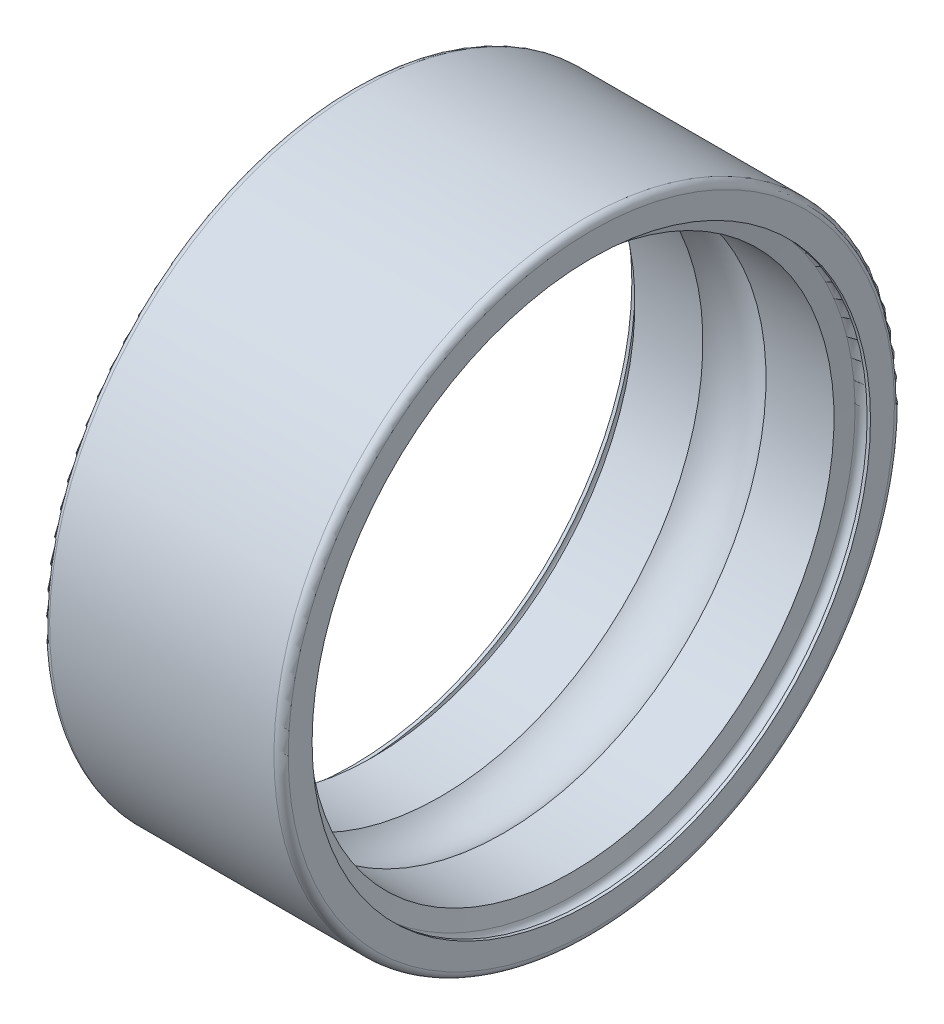
ISO-10303-21;
HEADER;
FILE_DESCRIPTION(('STEP AP214'),'2;1');
FILE_NAME('part.step','',(''),(''),'','','');
FILE_SCHEMA(('AUTOMOTIVE_DESIGN { 1 0 10303 214 1 1 1 1 }'));
ENDSEC;
DATA;
#1=APPLICATION_CONTEXT('core data for automotive mechanical design processes');
#2=APPLICATION_PROTOCOL_DEFINITION('international standard','automotive_design',2000,#1);
#3=PRODUCT_CONTEXT('',#1,'mechanical');
#4=PRODUCT('Part','Part','',(#3));
#5=PRODUCT_RELATED_PRODUCT_CATEGORY('part','',(#4));
#6=PRODUCT_DEFINITION_FORMATION('','',#4);
#7=PRODUCT_DEFINITION_CONTEXT('part definition',#1,'design');
#8=PRODUCT_DEFINITION('design','',#6,#7);
#9=PRODUCT_DEFINITION_SHAPE('','',#8);
#10=(LENGTH_UNIT() NAMED_UNIT(*) SI_UNIT(.MILLI.,.METRE.));
#11=(NAMED_UNIT(*) PLANE_ANGLE_UNIT() SI_UNIT($,.RADIAN.));
#12=(NAMED_UNIT(*) SI_UNIT($,.STERADIAN.) SOLID_ANGLE_UNIT());
#13=UNCERTAINTY_MEASURE_WITH_UNIT(LENGTH_MEASURE(1.E-05),#10,'distance_accuracy_value','');
#14=(GEOMETRIC_REPRESENTATION_CONTEXT(3) GLOBAL_UNCERTAINTY_ASSIGNED_CONTEXT((#13)) GLOBAL_UNIT_ASSIGNED_CONTEXT((#10,
#11,#12)) REPRESENTATION_CONTEXT('',''));
#15=CARTESIAN_POINT('',(0.,0.,0.));
#16=DIRECTION('',(0.,0.,1.));
#17=DIRECTION('',(1.,0.,0.));
#18=AXIS2_PLACEMENT_3D('',#15,#16,#17);
#19=CARTESIAN_POINT('',(4.79,0.,0.));
#20=DIRECTION('',(1.,0.,0.));
#21=DIRECTION('',(0.,0.,1.));
#22=AXIS2_PLACEMENT_3D('',#19,#20,#21);
#23=TOROIDAL_SURFACE('',#22,5.85,0.14);
#24=CARTESIAN_POINT('',(4.93,0.,0.));
#25=DIRECTION('',(-1.,0.,0.));
#26=DIRECTION('',(0.,1.,0.));
#27=AXIS2_PLACEMENT_3D('',#24,#25,#26);
#28=CIRCLE('',#27,5.85);
#29=CARTESIAN_POINT('',(4.93,5.85,0.));
#30=VERTEX_POINT('',#29);
#31=EDGE_CURVE('E11',#30,#30,#28,.T.);
#32=ORIENTED_EDGE('',*,*,#31,.F.);
#33=EDGE_LOOP('',(#32));
#34=FACE_BOUND('',#33,.T.);
#35=CARTESIAN_POINT('',(4.65212691457829,0.,0.));
#36=DIRECTION('',(-1.,0.,0.));
#37=DIRECTION('',(0.,1.,0.));
#38=AXIS2_PLACEMENT_3D('',#35,#36,#37);
#39=CIRCLE('',#38,5.87431074487337);
#40=CARTESIAN_POINT('',(4.65212691457829,5.87431074487337,0.));
#41=VERTEX_POINT('',#40);
#42=EDGE_CURVE('E96',#41,#41,#39,.T.);
#43=ORIENTED_EDGE('',*,*,#42,.T.);
#44=EDGE_LOOP('',(#43));
#45=FACE_BOUND('',#44,.T.);
#46=ADVANCED_FACE('F37',(#34,#45),#23,.F.);
#47=CARTESIAN_POINT('',(4.965,0.,0.));
#48=DIRECTION('',(-1.,0.,0.));
#49=DIRECTION('',(0.,1.,0.));
#50=AXIS2_PLACEMENT_3D('',#47,#48,#49);
#51=CYLINDRICAL_SURFACE('',#50,5.85);
#52=CARTESIAN_POINT('',(5.,0.,0.));
#53=DIRECTION('',(-1.,0.,0.));
#54=DIRECTION('',(0.,1.,0.));
#55=AXIS2_PLACEMENT_3D('',#52,#53,#54);
#56=CIRCLE('',#55,5.85);
#57=CARTESIAN_POINT('',(5.,5.85,0.));
#58=VERTEX_POINT('',#57);
#59=EDGE_CURVE('E41',#58,#58,#56,.T.);
#60=ORIENTED_EDGE('',*,*,#59,.F.);
#61=EDGE_LOOP('',(#60));
#62=FACE_BOUND('',#61,.T.);
#63=ORIENTED_EDGE('',*,*,#31,.T.);
#64=EDGE_LOOP('',(#63));
#65=FACE_BOUND('',#64,.T.);
#66=ADVANCED_FACE('F146',(#62,#65),#51,.F.);
#67=CARTESIAN_POINT('',(5.,6.1,0.));
#68=DIRECTION('',(1.,0.,0.));
#69=DIRECTION('',(0.,1.,0.));
#70=AXIS2_PLACEMENT_3D('',#67,#68,#69);
#71=PLANE('',#70);
#72=CARTESIAN_POINT('',(5.,0.,0.));
#73=DIRECTION('',(-1.,0.,0.));
#74=DIRECTION('',(0.,1.,0.));
#75=AXIS2_PLACEMENT_3D('',#72,#73,#74);
#76=CIRCLE('',#75,6.35);
#77=CARTESIAN_POINT('',(5.,6.35,0.));
#78=VERTEX_POINT('',#77);
#79=EDGE_CURVE('E78',#78,#78,#76,.T.);
#80=ORIENTED_EDGE('',*,*,#79,.F.);
#81=EDGE_LOOP('',(#80));
#82=FACE_BOUND('',#81,.T.);
#83=ORIENTED_EDGE('',*,*,#59,.T.);
#84=EDGE_LOOP('',(#83));
#85=FACE_BOUND('',#84,.T.);
#86=ADVANCED_FACE('F144',(#82,#85),#71,.T.);
#87=CARTESIAN_POINT('',(4.85,0.,0.));
#88=DIRECTION('',(1.,0.,0.));
#89=DIRECTION('',(0.,0.,1.));
#90=AXIS2_PLACEMENT_3D('',#87,#88,#89);
#91=TOROIDAL_SURFACE('',#90,6.35,0.15);
#92=CARTESIAN_POINT('',(4.85,0.,0.));
#93=DIRECTION('',(-1.,0.,0.));
#94=DIRECTION('',(0.,1.,0.));
#95=AXIS2_PLACEMENT_3D('',#92,#93,#94);
#96=CIRCLE('',#95,6.5);
#97=CARTESIAN_POINT('',(4.85,6.5,0.));
#98=VERTEX_POINT('',#97);
#99=EDGE_CURVE('E75',#98,#98,#96,.T.);
#100=ORIENTED_EDGE('',*,*,#99,.F.);
#101=EDGE_LOOP('',(#100));
#102=FACE_BOUND('',#101,.T.);
#103=ORIENTED_EDGE('',*,*,#79,.T.);
#104=EDGE_LOOP('',(#103));
#105=FACE_BOUND('',#104,.T.);
#106=ADVANCED_FACE('F39',(#102,#105),#91,.T.);
#107=CARTESIAN_POINT('',(2.5,0.,0.));
#108=DIRECTION('',(-1.,0.,0.));
#109=DIRECTION('',(0.,1.,0.));
#110=AXIS2_PLACEMENT_3D('',#107,#108,#109);
#111=CYLINDRICAL_SURFACE('',#110,6.5);
#112=CARTESIAN_POINT('',(0.15,0.,0.));
#113=DIRECTION('',(-1.,0.,0.));
#114=DIRECTION('',(0.,1.,0.));
#115=AXIS2_PLACEMENT_3D('',#112,#113,#114);
#116=CIRCLE('',#115,6.5);
#117=CARTESIAN_POINT('',(0.15,6.5,0.));
#118=VERTEX_POINT('',#117);
#119=EDGE_CURVE('E79',#118,#118,#116,.T.);
#120=ORIENTED_EDGE('',*,*,#119,.F.);
#121=EDGE_LOOP('',(#120));
#122=FACE_BOUND('',#121,.T.);
#123=ORIENTED_EDGE('',*,*,#99,.T.);
#124=EDGE_LOOP('',(#123));
#125=FACE_BOUND('',#124,.T.);
#126=ADVANCED_FACE('F76',(#122,#125),#111,.T.);
#127=CARTESIAN_POINT('',(0.15,0.,0.));
#128=DIRECTION('',(1.,0.,0.));
#129=DIRECTION('',(0.,0.,1.));
#130=AXIS2_PLACEMENT_3D('',#127,#128,#129);
#131=TOROIDAL_SURFACE('',#130,6.35,0.15);
#132=CARTESIAN_POINT('',(0.,0.,0.));
#133=DIRECTION('',(-1.,0.,0.));
#134=DIRECTION('',(0.,1.,0.));
#135=AXIS2_PLACEMENT_3D('',#132,#133,#134);
#136=CIRCLE('',#135,6.35);
#137=CARTESIAN_POINT('',(0.,6.35,0.));
#138=VERTEX_POINT('',#137);
#139=EDGE_CURVE('E82',#138,#138,#136,.T.);
#140=ORIENTED_EDGE('',*,*,#139,.F.);
#141=EDGE_LOOP('',(#140));
#142=FACE_BOUND('',#141,.T.);
#143=ORIENTED_EDGE('',*,*,#119,.T.);
#144=EDGE_LOOP('',(#143));
#145=FACE_BOUND('',#144,.T.);
#146=ADVANCED_FACE('F131',(#142,#145),#131,.T.);
#147=CARTESIAN_POINT('',(0.,6.1,0.));
#148=DIRECTION('',(-1.,0.,0.));
#149=DIRECTION('',(0.,-1.,0.));
#150=AXIS2_PLACEMENT_3D('',#147,#148,#149);
#151=PLANE('',#150);
#152=CARTESIAN_POINT('',(0.,0.,0.));
#153=DIRECTION('',(-1.,0.,0.));
#154=DIRECTION('',(0.,1.,0.));
#155=AXIS2_PLACEMENT_3D('',#152,#153,#154);
#156=CIRCLE('',#155,5.85);
#157=CARTESIAN_POINT('',(0.,5.85,0.));
#158=VERTEX_POINT('',#157);
#159=EDGE_CURVE('E92',#158,#158,#156,.T.);
#160=ORIENTED_EDGE('',*,*,#159,.F.);
#161=EDGE_LOOP('',(#160));
#162=FACE_BOUND('',#161,.T.);
#163=ORIENTED_EDGE('',*,*,#139,.T.);
#164=EDGE_LOOP('',(#163));
#165=FACE_BOUND('',#164,.T.);
#166=ADVANCED_FACE('F125',(#162,#165),#151,.T.);
#167=CARTESIAN_POINT('',(0.035,0.,0.));
#168=DIRECTION('',(-1.,0.,0.));
#169=DIRECTION('',(0.,1.,0.));
#170=AXIS2_PLACEMENT_3D('',#167,#168,#169);
#171=CYLINDRICAL_SURFACE('',#170,5.85);
#172=CARTESIAN_POINT('',(0.07,0.,0.));
#173=DIRECTION('',(-1.,0.,0.));
#174=DIRECTION('',(0.,1.,0.));
#175=AXIS2_PLACEMENT_3D('',#172,#173,#174);
#176=CIRCLE('',#175,5.85);
#177=CARTESIAN_POINT('',(0.07,5.85,0.));
#178=VERTEX_POINT('',#177);
#179=EDGE_CURVE('E93',#178,#178,#176,.T.);
#180=ORIENTED_EDGE('',*,*,#179,.F.);
#181=EDGE_LOOP('',(#180));
#182=FACE_BOUND('',#181,.T.);
#183=ORIENTED_EDGE('',*,*,#159,.T.);
#184=EDGE_LOOP('',(#183));
#185=FACE_BOUND('',#184,.T.);
#186=ADVANCED_FACE('F119',(#182,#185),#171,.F.);
#187=CARTESIAN_POINT('',(0.21,0.,0.));
#188=DIRECTION('',(1.,0.,0.));
#189=DIRECTION('',(0.,0.,1.));
#190=AXIS2_PLACEMENT_3D('',#187,#188,#189);
#191=TOROIDAL_SURFACE('',#190,5.85,0.14);
#192=CARTESIAN_POINT('',(0.347873085421709,0.,0.));
#193=DIRECTION('',(-1.,0.,0.));
#194=DIRECTION('',(0.,1.,0.));
#195=AXIS2_PLACEMENT_3D('',#192,#193,#194);
#196=CIRCLE('',#195,5.87431074487337);
#197=CARTESIAN_POINT('',(0.347873085421709,5.87431074487337,0.));
#198=VERTEX_POINT('',#197);
#199=EDGE_CURVE('E87',#198,#198,#196,.T.);
#200=ORIENTED_EDGE('',*,*,#199,.F.);
#201=EDGE_LOOP('',(#200));
#202=FACE_BOUND('',#201,.T.);
#203=ORIENTED_EDGE('',*,*,#179,.T.);
#204=EDGE_LOOP('',(#203));
#205=FACE_BOUND('',#204,.T.);
#206=ADVANCED_FACE('F116',(#202,#205),#191,.F.);
#207=CARTESIAN_POINT('',(0.380873627166838,0.,0.));
#208=DIRECTION('',(-1.,0.,0.));
#209=DIRECTION('',(0.,1.,0.));
#210=AXIS2_PLACEMENT_3D('',#207,#208,#209);
#211=CONICAL_SURFACE('',#210,5.68715537243669,1.39626340159546);
#212=CARTESIAN_POINT('',(0.413874168911967,0.,0.));
#213=DIRECTION('',(-1.,0.,0.));
#214=DIRECTION('',(0.,1.,0.));
#215=AXIS2_PLACEMENT_3D('',#212,#213,#214);
#216=CIRCLE('',#215,5.5);
#217=CARTESIAN_POINT('',(0.413874168911966,5.5,0.));
#218=VERTEX_POINT('',#217);
#219=EDGE_CURVE('E86',#218,#218,#216,.T.);
#220=ORIENTED_EDGE('',*,*,#219,.F.);
#221=EDGE_LOOP('',(#220));
#222=FACE_BOUND('',#221,.T.);
#223=ORIENTED_EDGE('',*,*,#199,.T.);
#224=EDGE_LOOP('',(#223));
#225=FACE_BOUND('',#224,.T.);
#226=ADVANCED_FACE('F114',(#222,#225),#211,.F.);
#227=CARTESIAN_POINT('',(1.12621817057291,0.,0.));
#228=DIRECTION('',(-1.,0.,0.));
#229=DIRECTION('',(0.,1.,0.));
#230=AXIS2_PLACEMENT_3D('',#227,#228,#229);
#231=CYLINDRICAL_SURFACE('',#230,5.5);
#232=CARTESIAN_POINT('',(1.83856217223385,0.,0.));
#233=DIRECTION('',(-1.,0.,0.));
#234=DIRECTION('',(0.,1.,0.));
#235=AXIS2_PLACEMENT_3D('',#232,#233,#234);
#236=CIRCLE('',#235,5.5);
#237=CARTESIAN_POINT('',(1.83856217223385,5.5,0.));
#238=VERTEX_POINT('',#237);
#239=EDGE_CURVE('E88',#238,#238,#236,.T.);
#240=ORIENTED_EDGE('',*,*,#239,.F.);
#241=EDGE_LOOP('',(#240));
#242=FACE_BOUND('',#241,.T.);
#243=ORIENTED_EDGE('',*,*,#219,.T.);
#244=EDGE_LOOP('',(#243));
#245=FACE_BOUND('',#244,.T.);
#246=ADVANCED_FACE('F156',(#242,#245),#231,.F.);
#247=CARTESIAN_POINT('',(2.5,0.,0.));
#248=DIRECTION('',(1.,0.,0.));
#249=DIRECTION('',(0.,0.,1.));
#250=AXIS2_PLACEMENT_3D('',#247,#248,#249);
#251=TOROIDAL_SURFACE('',#250,4.75,1.);
#252=CARTESIAN_POINT('',(3.16143782776615,0.,0.));
#253=DIRECTION('',(-1.,0.,0.));
#254=DIRECTION('',(0.,1.,0.));
#255=AXIS2_PLACEMENT_3D('',#252,#253,#254);
#256=CIRCLE('',#255,5.5);
#257=CARTESIAN_POINT('',(3.16143782776615,5.5,0.));
#258=VERTEX_POINT('',#257);
#259=EDGE_CURVE('E99',#258,#258,#256,.T.);
#260=ORIENTED_EDGE('',*,*,#259,.F.);
#261=EDGE_LOOP('',(#260));
#262=FACE_BOUND('',#261,.T.);
#263=ORIENTED_EDGE('',*,*,#239,.T.);
#264=EDGE_LOOP('',(#263));
#265=FACE_BOUND('',#264,.T.);
#266=ADVANCED_FACE('F159',(#262,#265),#251,.F.);
#267=CARTESIAN_POINT('',(3.87378182942709,0.,0.));
#268=DIRECTION('',(-1.,0.,0.));
#269=DIRECTION('',(0.,1.,0.));
#270=AXIS2_PLACEMENT_3D('',#267,#268,#269);
#271=CYLINDRICAL_SURFACE('',#270,5.5);
#272=CARTESIAN_POINT('',(4.58612583108803,0.,0.));
#273=DIRECTION('',(-1.,0.,0.));
#274=DIRECTION('',(0.,1.,0.));
#275=AXIS2_PLACEMENT_3D('',#272,#273,#274);
#276=CIRCLE('',#275,5.5);
#277=CARTESIAN_POINT('',(4.58612583108803,5.5,0.));
#278=VERTEX_POINT('',#277);
#279=EDGE_CURVE('E100',#278,#278,#276,.T.);
#280=ORIENTED_EDGE('',*,*,#279,.F.);
#281=EDGE_LOOP('',(#280));
#282=FACE_BOUND('',#281,.T.);
#283=ORIENTED_EDGE('',*,*,#259,.T.);
#284=EDGE_LOOP('',(#283));
#285=FACE_BOUND('',#284,.T.);
#286=ADVANCED_FACE('F163',(#282,#285),#271,.F.);
#287=CARTESIAN_POINT('',(4.61912637283316,0.,0.));
#288=DIRECTION('',(1.,0.,0.));
#289=DIRECTION('',(0.,1.,0.));
#290=AXIS2_PLACEMENT_3D('',#287,#288,#289);
#291=CONICAL_SURFACE('',#290,5.68715537243669,1.39626340159546);
#292=ORIENTED_EDGE('',*,*,#42,.F.);
#293=EDGE_LOOP('',(#292));
#294=FACE_BOUND('',#293,.T.);
#295=ORIENTED_EDGE('',*,*,#279,.T.);
#296=EDGE_LOOP('',(#295));
#297=FACE_BOUND('',#296,.T.);
#298=ADVANCED_FACE('F167',(#294,#297),#291,.F.);
#299=CLOSED_SHELL('',(#46,#66,#86,#106,#126,#146,#166,#186,#206,#226,#246,#266,#286,#298));
#300=MANIFOLD_SOLID_BREP('B2',#299);
#301=ADVANCED_BREP_SHAPE_REPRESENTATION('',(#18,#300),#14);
#302=SHAPE_DEFINITION_REPRESENTATION(#9,#301);
ENDSEC;
END-ISO-10303-21;
